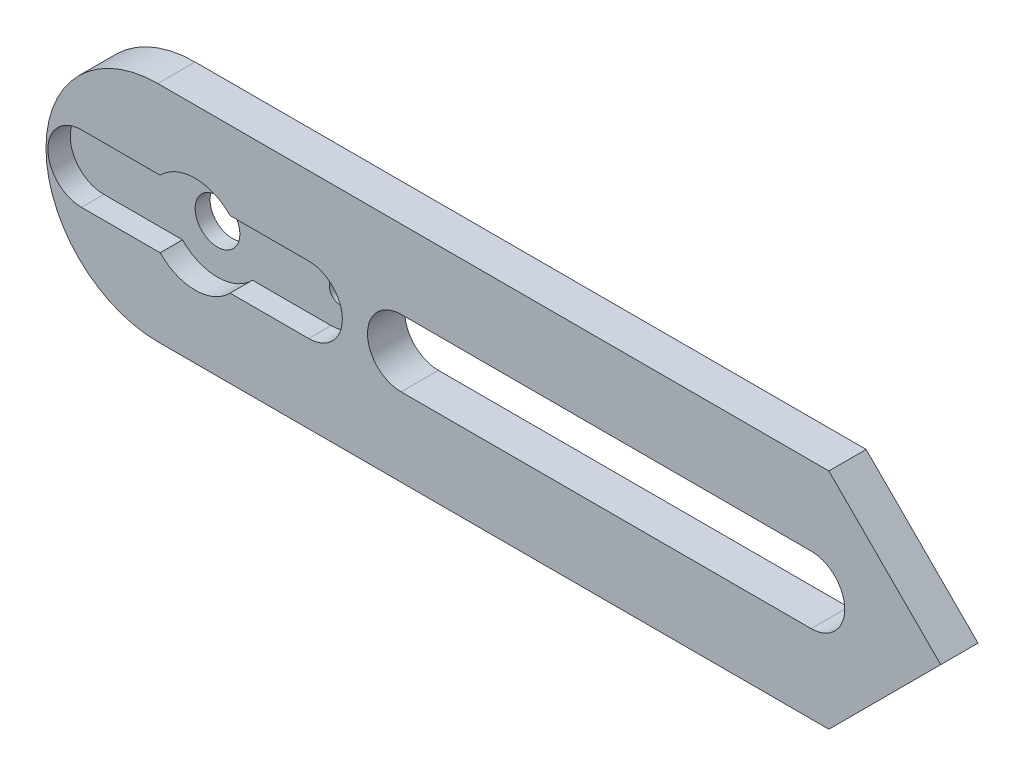
ISO-10303-21;
HEADER;
FILE_DESCRIPTION(('STEP AP214'),'2;1');
FILE_NAME('part.step','',(''),(''),'','','');
FILE_SCHEMA(('AUTOMOTIVE_DESIGN { 1 0 10303 214 1 1 1 1 }'));
ENDSEC;
DATA;
#1=APPLICATION_CONTEXT('core data for automotive mechanical design processes');
#2=APPLICATION_PROTOCOL_DEFINITION('international standard','automotive_design',2000,#1);
#3=PRODUCT_CONTEXT('',#1,'mechanical');
#4=PRODUCT('Part','Part','',(#3));
#5=PRODUCT_RELATED_PRODUCT_CATEGORY('part','',(#4));
#6=PRODUCT_DEFINITION_FORMATION('','',#4);
#7=PRODUCT_DEFINITION_CONTEXT('part definition',#1,'design');
#8=PRODUCT_DEFINITION('design','',#6,#7);
#9=PRODUCT_DEFINITION_SHAPE('','',#8);
#10=(LENGTH_UNIT() NAMED_UNIT(*) SI_UNIT(.MILLI.,.METRE.));
#11=(NAMED_UNIT(*) PLANE_ANGLE_UNIT() SI_UNIT($,.RADIAN.));
#12=(NAMED_UNIT(*) SI_UNIT($,.STERADIAN.) SOLID_ANGLE_UNIT());
#13=UNCERTAINTY_MEASURE_WITH_UNIT(LENGTH_MEASURE(1.E-05),#10,'distance_accuracy_value','');
#14=(GEOMETRIC_REPRESENTATION_CONTEXT(3) GLOBAL_UNCERTAINTY_ASSIGNED_CONTEXT((#13)) GLOBAL_UNIT_ASSIGNED_CONTEXT((#10,
#11,#12)) REPRESENTATION_CONTEXT('',''));
#15=CARTESIAN_POINT('',(0.,0.,0.));
#16=DIRECTION('',(0.,0.,1.));
#17=DIRECTION('',(1.,0.,0.));
#18=AXIS2_PLACEMENT_3D('',#15,#16,#17);
#19=CARTESIAN_POINT('',(-28.5,0.,0.));
#20=DIRECTION('',(0.,0.,1.));
#21=DIRECTION('',(1.,0.,0.));
#22=AXIS2_PLACEMENT_3D('',#19,#20,#21);
#23=CYLINDRICAL_SURFACE('',#22,1.5);
#24=CARTESIAN_POINT('',(-28.5,0.,0.));
#25=DIRECTION('',(0.,0.,1.));
#26=DIRECTION('',(1.,0.,0.));
#27=AXIS2_PLACEMENT_3D('',#24,#25,#26);
#28=CIRCLE('',#27,1.5);
#29=CARTESIAN_POINT('',(-27.,0.,0.));
#30=VERTEX_POINT('',#29);
#31=EDGE_CURVE('E238',#30,#30,#28,.T.);
#32=ORIENTED_EDGE('',*,*,#31,.F.);
#33=EDGE_LOOP('',(#32));
#34=FACE_BOUND('',#33,.T.);
#35=CARTESIAN_POINT('',(-28.5,0.,2.));
#36=DIRECTION('',(0.,0.,1.));
#37=DIRECTION('',(1.,0.,0.));
#38=AXIS2_PLACEMENT_3D('',#35,#36,#37);
#39=CIRCLE('',#38,1.5);
#40=CARTESIAN_POINT('',(-27.,0.,2.));
#41=VERTEX_POINT('',#40);
#42=EDGE_CURVE('E216',#41,#41,#39,.F.);
#43=ORIENTED_EDGE('',*,*,#42,.F.);
#44=EDGE_LOOP('',(#43));
#45=FACE_BOUND('',#44,.T.);
#46=ADVANCED_FACE('F33',(#34,#45),#23,.F.);
#47=CARTESIAN_POINT('',(-45.,0.,2.));
#48=DIRECTION('',(0.,0.,1.));
#49=DIRECTION('',(1.,0.,0.));
#50=AXIS2_PLACEMENT_3D('',#47,#48,#49);
#51=CYLINDRICAL_SURFACE('',#50,6.5);
#52=CARTESIAN_POINT('',(-45.,0.,5.));
#53=DIRECTION('',(0.,0.,1.));
#54=DIRECTION('',(1.,0.,0.));
#55=AXIS2_PLACEMENT_3D('',#52,#53,#54);
#56=CIRCLE('',#55,6.5);
#57=CARTESIAN_POINT('',(-49.6904157598234,-4.49999999999999,5.));
#58=VERTEX_POINT('',#57);
#59=CARTESIAN_POINT('',(-40.3095842401766,-4.49999999999999,5.));
#60=VERTEX_POINT('',#59);
#61=EDGE_CURVE('E225',#58,#60,#56,.T.);
#62=ORIENTED_EDGE('',*,*,#61,.T.);
#63=DIRECTION('',(0.,0.,1.));
#64=VECTOR('',#63,1.);
#65=CARTESIAN_POINT('',(-40.3095842401766,-4.49999999999999,2.));
#66=LINE('',#65,#64);
#67=CARTESIAN_POINT('',(-40.3095842401766,-4.49999999999999,2.));
#68=VERTEX_POINT('',#67);
#69=EDGE_CURVE('E11',#60,#68,#66,.F.);
#70=ORIENTED_EDGE('',*,*,#69,.T.);
#71=CARTESIAN_POINT('',(-45.,0.,2.));
#72=DIRECTION('',(0.,0.,1.));
#73=DIRECTION('',(1.,0.,0.));
#74=AXIS2_PLACEMENT_3D('',#71,#72,#73);
#75=CIRCLE('',#74,6.5);
#76=CARTESIAN_POINT('',(-49.6904157598234,-4.49999999999999,2.));
#77=VERTEX_POINT('',#76);
#78=EDGE_CURVE('E230',#77,#68,#75,.T.);
#79=ORIENTED_EDGE('',*,*,#78,.F.);
#80=DIRECTION('',(0.,0.,1.));
#81=VECTOR('',#80,1.);
#82=CARTESIAN_POINT('',(-49.6904157598234,-4.5,2.));
#83=LINE('',#82,#81);
#84=EDGE_CURVE('E41',#77,#58,#83,.T.);
#85=ORIENTED_EDGE('',*,*,#84,.T.);
#86=EDGE_LOOP('',(#62,#70,#79,#85));
#87=FACE_BOUND('',#86,.T.);
#88=ADVANCED_FACE('F291',(#87),#51,.F.);
#89=CARTESIAN_POINT('',(-45.,0.,0.));
#90=DIRECTION('',(0.,0.,1.));
#91=DIRECTION('',(1.,0.,0.));
#92=AXIS2_PLACEMENT_3D('',#89,#90,#91);
#93=CYLINDRICAL_SURFACE('',#92,3.);
#94=CARTESIAN_POINT('',(-45.,0.,0.));
#95=DIRECTION('',(0.,0.,1.));
#96=DIRECTION('',(1.,0.,0.));
#97=AXIS2_PLACEMENT_3D('',#94,#95,#96);
#98=CIRCLE('',#97,3.);
#99=CARTESIAN_POINT('',(-42.,0.,0.));
#100=VERTEX_POINT('',#99);
#101=EDGE_CURVE('E234',#100,#100,#98,.T.);
#102=ORIENTED_EDGE('',*,*,#101,.F.);
#103=EDGE_LOOP('',(#102));
#104=FACE_BOUND('',#103,.T.);
#105=CARTESIAN_POINT('',(-45.,0.,2.));
#106=DIRECTION('',(0.,0.,1.));
#107=DIRECTION('',(1.,0.,0.));
#108=AXIS2_PLACEMENT_3D('',#105,#106,#107);
#109=CIRCLE('',#108,3.);
#110=CARTESIAN_POINT('',(-42.,0.,2.));
#111=VERTEX_POINT('',#110);
#112=EDGE_CURVE('E229',#111,#111,#109,.F.);
#113=ORIENTED_EDGE('',*,*,#112,.F.);
#114=EDGE_LOOP('',(#113));
#115=FACE_BOUND('',#114,.T.);
#116=ADVANCED_FACE('F345',(#104,#115),#93,.F.);
#117=CARTESIAN_POINT('',(40.,15.,5.));
#118=DIRECTION('',(0.,-1.,0.));
#119=DIRECTION('',(0.,0.,-1.));
#120=AXIS2_PLACEMENT_3D('',#117,#118,#119);
#121=PLANE('',#120);
#122=DIRECTION('',(-1.,0.,0.));
#123=VECTOR('',#122,1.);
#124=CARTESIAN_POINT('',(40.,15.,0.));
#125=LINE('',#124,#123);
#126=CARTESIAN_POINT('',(40.,15.,0.));
#127=VERTEX_POINT('',#126);
#128=CARTESIAN_POINT('',(-50.0000000000001,15.,0.));
#129=VERTEX_POINT('',#128);
#130=EDGE_CURVE('E237',#127,#129,#125,.T.);
#131=ORIENTED_EDGE('',*,*,#130,.T.);
#132=DIRECTION('',(0.,0.,-1.));
#133=VECTOR('',#132,1.);
#134=CARTESIAN_POINT('',(-50.0000000000001,15.,5.));
#135=LINE('',#134,#133);
#136=CARTESIAN_POINT('',(-50.0000000000001,15.,5.));
#137=VERTEX_POINT('',#136);
#138=EDGE_CURVE('E275',#137,#129,#135,.T.);
#139=ORIENTED_EDGE('',*,*,#138,.F.);
#140=DIRECTION('',(-1.,0.,0.));
#141=VECTOR('',#140,1.);
#142=CARTESIAN_POINT('',(40.,15.,5.));
#143=LINE('',#142,#141);
#144=CARTESIAN_POINT('',(40.,15.,5.));
#145=VERTEX_POINT('',#144);
#146=EDGE_CURVE('E241',#145,#137,#143,.T.);
#147=ORIENTED_EDGE('',*,*,#146,.F.);
#148=DIRECTION('',(0.,0.,-1.));
#149=VECTOR('',#148,1.);
#150=CARTESIAN_POINT('',(40.,15.,5.));
#151=LINE('',#150,#149);
#152=EDGE_CURVE('E254',#145,#127,#151,.T.);
#153=ORIENTED_EDGE('',*,*,#152,.T.);
#154=EDGE_LOOP('',(#131,#139,#147,#153));
#155=FACE_BOUND('',#154,.T.);
#156=ADVANCED_FACE('F35',(#155),#121,.F.);
#157=CARTESIAN_POINT('',(-50.,0.,5.));
#158=DIRECTION('',(0.,0.,-1.));
#159=DIRECTION('',(-1.,0.,0.));
#160=AXIS2_PLACEMENT_3D('',#157,#158,#159);
#161=CYLINDRICAL_SURFACE('',#160,15.);
#162=CARTESIAN_POINT('',(-50.,0.,0.));
#163=DIRECTION('',(0.,0.,1.));
#164=DIRECTION('',(1.,0.,0.));
#165=AXIS2_PLACEMENT_3D('',#162,#163,#164);
#166=CIRCLE('',#165,15.);
#167=CARTESIAN_POINT('',(-49.9999999999999,-15.,0.));
#168=VERTEX_POINT('',#167);
#169=EDGE_CURVE('E257',#129,#168,#166,.T.);
#170=ORIENTED_EDGE('',*,*,#169,.T.);
#171=DIRECTION('',(0.,0.,-1.));
#172=VECTOR('',#171,1.);
#173=CARTESIAN_POINT('',(-49.9999999999999,-15.,5.));
#174=LINE('',#173,#172);
#175=CARTESIAN_POINT('',(-49.9999999999999,-15.,5.));
#176=VERTEX_POINT('',#175);
#177=EDGE_CURVE('E273',#176,#168,#174,.T.);
#178=ORIENTED_EDGE('',*,*,#177,.F.);
#179=CARTESIAN_POINT('',(-50.,0.,5.));
#180=DIRECTION('',(0.,0.,1.));
#181=DIRECTION('',(1.,0.,0.));
#182=AXIS2_PLACEMENT_3D('',#179,#180,#181);
#183=CIRCLE('',#182,15.);
#184=EDGE_CURVE('E244',#137,#176,#183,.T.);
#185=ORIENTED_EDGE('',*,*,#184,.F.);
#186=ORIENTED_EDGE('',*,*,#138,.T.);
#187=EDGE_LOOP('',(#170,#178,#185,#186));
#188=FACE_BOUND('',#187,.T.);
#189=ADVANCED_FACE('F365',(#188),#161,.T.);
#190=CARTESIAN_POINT('',(40.,-15.,5.));
#191=DIRECTION('',(0.,-1.,0.));
#192=DIRECTION('',(1.,0.,0.));
#193=AXIS2_PLACEMENT_3D('',#190,#191,#192);
#194=PLANE('',#193);
#195=DIRECTION('',(-1.,0.,0.));
#196=VECTOR('',#195,1.);
#197=CARTESIAN_POINT('',(40.,-15.,0.));
#198=LINE('',#197,#196);
#199=CARTESIAN_POINT('',(40.,-15.,0.));
#200=VERTEX_POINT('',#199);
#201=EDGE_CURVE('E260',#200,#168,#198,.T.);
#202=ORIENTED_EDGE('',*,*,#201,.F.);
#203=DIRECTION('',(0.,0.,-1.));
#204=VECTOR('',#203,1.);
#205=CARTESIAN_POINT('',(40.,-15.,5.));
#206=LINE('',#205,#204);
#207=CARTESIAN_POINT('',(40.,-15.,5.));
#208=VERTEX_POINT('',#207);
#209=EDGE_CURVE('E271',#208,#200,#206,.T.);
#210=ORIENTED_EDGE('',*,*,#209,.F.);
#211=DIRECTION('',(-1.,0.,0.));
#212=VECTOR('',#211,1.);
#213=CARTESIAN_POINT('',(40.,-15.,5.));
#214=LINE('',#213,#212);
#215=EDGE_CURVE('E247',#208,#176,#214,.T.);
#216=ORIENTED_EDGE('',*,*,#215,.T.);
#217=ORIENTED_EDGE('',*,*,#177,.T.);
#218=EDGE_LOOP('',(#202,#210,#216,#217));
#219=FACE_BOUND('',#218,.T.);
#220=ADVANCED_FACE('F362',(#219),#194,.T.);
#221=CARTESIAN_POINT('',(40.,-15.,5.));
#222=DIRECTION('',(-0.707106781186548,0.707106781186547,0.));
#223=DIRECTION('',(-0.707106781186547,-0.707106781186548,0.));
#224=AXIS2_PLACEMENT_3D('',#221,#222,#223);
#225=PLANE('',#224);
#226=DIRECTION('',(0.707106781186547,0.707106781186548,0.));
#227=VECTOR('',#226,1.);
#228=CARTESIAN_POINT('',(40.,-15.,0.));
#229=LINE('',#228,#227);
#230=CARTESIAN_POINT('',(55.,0.,0.));
#231=VERTEX_POINT('',#230);
#232=EDGE_CURVE('E263',#200,#231,#229,.T.);
#233=ORIENTED_EDGE('',*,*,#232,.T.);
#234=DIRECTION('',(0.,0.,-1.));
#235=VECTOR('',#234,1.);
#236=CARTESIAN_POINT('',(55.,0.,5.));
#237=LINE('',#236,#235);
#238=CARTESIAN_POINT('',(55.,0.,5.));
#239=VERTEX_POINT('',#238);
#240=EDGE_CURVE('E268',#239,#231,#237,.T.);
#241=ORIENTED_EDGE('',*,*,#240,.F.);
#242=DIRECTION('',(0.707106781186547,0.707106781186548,0.));
#243=VECTOR('',#242,1.);
#244=CARTESIAN_POINT('',(40.,-15.,5.));
#245=LINE('',#244,#243);
#246=EDGE_CURVE('E250',#208,#239,#245,.T.);
#247=ORIENTED_EDGE('',*,*,#246,.F.);
#248=ORIENTED_EDGE('',*,*,#209,.T.);
#249=EDGE_LOOP('',(#233,#241,#247,#248));
#250=FACE_BOUND('',#249,.T.);
#251=ADVANCED_FACE('F358',(#250),#225,.F.);
#252=CARTESIAN_POINT('',(55.,0.,5.));
#253=DIRECTION('',(-0.707106781186547,-0.707106781186548,0.));
#254=DIRECTION('',(0.707106781186548,-0.707106781186547,0.));
#255=AXIS2_PLACEMENT_3D('',#252,#253,#254);
#256=PLANE('',#255);
#257=DIRECTION('',(-0.707106781186548,0.707106781186547,0.));
#258=VECTOR('',#257,1.);
#259=CARTESIAN_POINT('',(55.,0.,0.));
#260=LINE('',#259,#258);
#261=EDGE_CURVE('E245',#231,#127,#260,.T.);
#262=ORIENTED_EDGE('',*,*,#261,.T.);
#263=ORIENTED_EDGE('',*,*,#152,.F.);
#264=DIRECTION('',(-0.707106781186548,0.707106781186547,0.));
#265=VECTOR('',#264,1.);
#266=CARTESIAN_POINT('',(55.,0.,5.));
#267=LINE('',#266,#265);
#268=EDGE_CURVE('E252',#239,#145,#267,.T.);
#269=ORIENTED_EDGE('',*,*,#268,.F.);
#270=ORIENTED_EDGE('',*,*,#240,.T.);
#271=EDGE_LOOP('',(#262,#263,#269,#270));
#272=FACE_BOUND('',#271,.T.);
#273=ADVANCED_FACE('F352',(#272),#256,.F.);
#274=CARTESIAN_POINT('',(-50.,0.,5.));
#275=DIRECTION('',(0.,0.,1.));
#276=DIRECTION('',(1.,0.,0.));
#277=AXIS2_PLACEMENT_3D('',#274,#275,#276);
#278=PLANE('',#277);
#279=CARTESIAN_POINT('',(-17.3786018999177,0.,5.));
#280=DIRECTION('',(0.,0.,1.));
#281=DIRECTION('',(1.,0.,0.));
#282=AXIS2_PLACEMENT_3D('',#279,#280,#281);
#283=CIRCLE('',#282,4.5);
#284=CARTESIAN_POINT('',(-17.3786018999177,4.5,5.));
#285=VERTEX_POINT('',#284);
#286=CARTESIAN_POINT('',(-17.3786018999177,-4.5,5.));
#287=VERTEX_POINT('',#286);
#288=EDGE_CURVE('E48',#285,#287,#283,.T.);
#289=ORIENTED_EDGE('',*,*,#288,.F.);
#290=DIRECTION('',(-1.,0.,0.));
#291=VECTOR('',#290,1.);
#292=CARTESIAN_POINT('',(-17.3786018999177,4.5,5.));
#293=LINE('',#292,#291);
#294=CARTESIAN_POINT('',(37.6213981000823,4.5,5.));
#295=VERTEX_POINT('',#294);
#296=EDGE_CURVE('E170',#295,#285,#293,.T.);
#297=ORIENTED_EDGE('',*,*,#296,.F.);
#298=CARTESIAN_POINT('',(37.6213981000823,0.,5.));
#299=DIRECTION('',(0.,0.,1.));
#300=DIRECTION('',(1.,0.,0.));
#301=AXIS2_PLACEMENT_3D('',#298,#299,#300);
#302=CIRCLE('',#301,4.5);
#303=CARTESIAN_POINT('',(37.6213981000823,-4.5,5.));
#304=VERTEX_POINT('',#303);
#305=EDGE_CURVE('E173',#304,#295,#302,.T.);
#306=ORIENTED_EDGE('',*,*,#305,.F.);
#307=DIRECTION('',(1.,0.,0.));
#308=VECTOR('',#307,1.);
#309=CARTESIAN_POINT('',(-17.3786018999177,-4.5,5.));
#310=LINE('',#309,#308);
#311=EDGE_CURVE('E179',#287,#304,#310,.T.);
#312=ORIENTED_EDGE('',*,*,#311,.F.);
#313=EDGE_LOOP('',(#289,#297,#306,#312));
#314=FACE_BOUND('',#313,.T.);
#315=DIRECTION('',(1.,0.,0.));
#316=VECTOR('',#315,1.);
#317=CARTESIAN_POINT('',(-29.7555356634191,-4.49999999999999,5.));
#318=LINE('',#317,#316);
#319=CARTESIAN_POINT('',(-29.7555356634191,-4.49999999999999,5.));
#320=VERTEX_POINT('',#319);
#321=EDGE_CURVE('E211',#60,#320,#318,.T.);
#322=ORIENTED_EDGE('',*,*,#321,.F.);
#323=ORIENTED_EDGE('',*,*,#61,.F.);
#324=CARTESIAN_POINT('',(-60.2444643365809,-4.5,5.));
#325=VERTEX_POINT('',#324);
#326=EDGE_CURVE('E193',#325,#58,#318,.T.);
#327=ORIENTED_EDGE('',*,*,#326,.F.);
#328=CARTESIAN_POINT('',(-60.2444643365809,0.,5.));
#329=DIRECTION('',(0.,0.,1.));
#330=DIRECTION('',(1.,0.,0.));
#331=AXIS2_PLACEMENT_3D('',#328,#329,#330);
#332=CIRCLE('',#331,4.5);
#333=CARTESIAN_POINT('',(-60.2444643365809,4.5,5.));
#334=VERTEX_POINT('',#333);
#335=EDGE_CURVE('E208',#334,#325,#332,.T.);
#336=ORIENTED_EDGE('',*,*,#335,.F.);
#337=DIRECTION('',(-1.,0.,0.));
#338=VECTOR('',#337,1.);
#339=CARTESIAN_POINT('',(-29.7555356634191,4.5,5.));
#340=LINE('',#339,#338);
#341=CARTESIAN_POINT('',(-49.6904157598234,4.49999999999999,5.));
#342=VERTEX_POINT('',#341);
#343=EDGE_CURVE('E205',#342,#334,#340,.T.);
#344=ORIENTED_EDGE('',*,*,#343,.F.);
#345=CARTESIAN_POINT('',(-40.3095842401766,4.5,5.));
#346=VERTEX_POINT('',#345);
#347=EDGE_CURVE('E231',#346,#342,#56,.T.);
#348=ORIENTED_EDGE('',*,*,#347,.F.);
#349=CARTESIAN_POINT('',(-29.7555356634191,4.5,5.));
#350=VERTEX_POINT('',#349);
#351=EDGE_CURVE('E206',#350,#346,#340,.T.);
#352=ORIENTED_EDGE('',*,*,#351,.F.);
#353=CARTESIAN_POINT('',(-29.7555356634191,0.,5.));
#354=DIRECTION('',(0.,0.,1.));
#355=DIRECTION('',(1.,0.,0.));
#356=AXIS2_PLACEMENT_3D('',#353,#354,#355);
#357=CIRCLE('',#356,4.5);
#358=EDGE_CURVE('E185',#320,#350,#357,.T.);
#359=ORIENTED_EDGE('',*,*,#358,.F.);
#360=EDGE_LOOP('',(#322,#323,#327,#336,#344,#348,#352,#359));
#361=FACE_BOUND('',#360,.T.);
#362=ORIENTED_EDGE('',*,*,#146,.T.);
#363=ORIENTED_EDGE('',*,*,#184,.T.);
#364=ORIENTED_EDGE('',*,*,#215,.F.);
#365=ORIENTED_EDGE('',*,*,#246,.T.);
#366=ORIENTED_EDGE('',*,*,#268,.T.);
#367=EDGE_LOOP('',(#362,#363,#364,#365,#366));
#368=FACE_BOUND('',#367,.T.);
#369=ADVANCED_FACE('F298',(#314,#361,#368),#278,.T.);
#370=CARTESIAN_POINT('',(-50.,0.,0.));
#371=DIRECTION('',(0.,0.,1.));
#372=DIRECTION('',(1.,0.,0.));
#373=AXIS2_PLACEMENT_3D('',#370,#371,#372);
#374=PLANE('',#373);
#375=DIRECTION('',(-1.,0.,0.));
#376=VECTOR('',#375,1.);
#377=CARTESIAN_POINT('',(-17.3786018999177,4.5,0.));
#378=LINE('',#377,#376);
#379=CARTESIAN_POINT('',(37.6213981000823,4.5,0.));
#380=VERTEX_POINT('',#379);
#381=CARTESIAN_POINT('',(-17.3786018999177,4.5,0.));
#382=VERTEX_POINT('',#381);
#383=EDGE_CURVE('E160',#380,#382,#378,.T.);
#384=ORIENTED_EDGE('',*,*,#383,.T.);
#385=CARTESIAN_POINT('',(-17.3786018999177,0.,0.));
#386=DIRECTION('',(0.,0.,1.));
#387=DIRECTION('',(1.,0.,0.));
#388=AXIS2_PLACEMENT_3D('',#385,#386,#387);
#389=CIRCLE('',#388,4.5);
#390=CARTESIAN_POINT('',(-17.3786018999177,-4.5,0.));
#391=VERTEX_POINT('',#390);
#392=EDGE_CURVE('E154',#382,#391,#389,.T.);
#393=ORIENTED_EDGE('',*,*,#392,.T.);
#394=DIRECTION('',(1.,0.,0.));
#395=VECTOR('',#394,1.);
#396=CARTESIAN_POINT('',(-17.3786018999177,-4.5,0.));
#397=LINE('',#396,#395);
#398=CARTESIAN_POINT('',(37.6213981000823,-4.5,0.));
#399=VERTEX_POINT('',#398);
#400=EDGE_CURVE('E163',#391,#399,#397,.T.);
#401=ORIENTED_EDGE('',*,*,#400,.T.);
#402=CARTESIAN_POINT('',(37.6213981000823,0.,0.));
#403=DIRECTION('',(0.,0.,1.));
#404=DIRECTION('',(1.,0.,0.));
#405=AXIS2_PLACEMENT_3D('',#402,#403,#404);
#406=CIRCLE('',#405,4.5);
#407=EDGE_CURVE('E56',#399,#380,#406,.T.);
#408=ORIENTED_EDGE('',*,*,#407,.T.);
#409=EDGE_LOOP('',(#384,#393,#401,#408));
#410=FACE_BOUND('',#409,.T.);
#411=ORIENTED_EDGE('',*,*,#101,.T.);
#412=EDGE_LOOP('',(#411));
#413=FACE_BOUND('',#412,.T.);
#414=ORIENTED_EDGE('',*,*,#31,.T.);
#415=EDGE_LOOP('',(#414));
#416=FACE_BOUND('',#415,.T.);
#417=ORIENTED_EDGE('',*,*,#130,.F.);
#418=ORIENTED_EDGE('',*,*,#261,.F.);
#419=ORIENTED_EDGE('',*,*,#232,.F.);
#420=ORIENTED_EDGE('',*,*,#201,.T.);
#421=ORIENTED_EDGE('',*,*,#169,.F.);
#422=EDGE_LOOP('',(#417,#418,#419,#420,#421));
#423=FACE_BOUND('',#422,.T.);
#424=ADVANCED_FACE('F167',(#410,#413,#416,#423),#374,.F.);
#425=CARTESIAN_POINT('',(-45.,0.,2.));
#426=DIRECTION('',(0.,0.,1.));
#427=DIRECTION('',(1.,0.,0.));
#428=AXIS2_PLACEMENT_3D('',#425,#426,#427);
#429=PLANE('',#428);
#430=CARTESIAN_POINT('',(-40.3095842401766,4.5,2.));
#431=VERTEX_POINT('',#430);
#432=CARTESIAN_POINT('',(-49.6904157598234,4.49999999999999,2.));
#433=VERTEX_POINT('',#432);
#434=EDGE_CURVE('E226',#431,#433,#75,.T.);
#435=ORIENTED_EDGE('',*,*,#434,.T.);
#436=DIRECTION('',(-1.,0.,0.));
#437=VECTOR('',#436,1.);
#438=CARTESIAN_POINT('',(-29.7555356634191,4.5,2.));
#439=LINE('',#438,#437);
#440=CARTESIAN_POINT('',(-60.2444643365809,4.5,2.));
#441=VERTEX_POINT('',#440);
#442=EDGE_CURVE('E192',#433,#441,#439,.T.);
#443=ORIENTED_EDGE('',*,*,#442,.T.);
#444=CARTESIAN_POINT('',(-60.2444643365809,0.,2.));
#445=DIRECTION('',(0.,0.,1.));
#446=DIRECTION('',(1.,0.,0.));
#447=AXIS2_PLACEMENT_3D('',#444,#445,#446);
#448=CIRCLE('',#447,4.5);
#449=CARTESIAN_POINT('',(-60.2444643365809,-4.5,2.));
#450=VERTEX_POINT('',#449);
#451=EDGE_CURVE('E196',#441,#450,#448,.T.);
#452=ORIENTED_EDGE('',*,*,#451,.T.);
#453=DIRECTION('',(1.,0.,0.));
#454=VECTOR('',#453,1.);
#455=CARTESIAN_POINT('',(-29.7555356634191,-4.49999999999999,2.));
#456=LINE('',#455,#454);
#457=EDGE_CURVE('E200',#450,#77,#456,.T.);
#458=ORIENTED_EDGE('',*,*,#457,.T.);
#459=ORIENTED_EDGE('',*,*,#78,.T.);
#460=CARTESIAN_POINT('',(-29.7555356634191,-4.49999999999999,2.));
#461=VERTEX_POINT('',#460);
#462=EDGE_CURVE('E199',#68,#461,#456,.T.);
#463=ORIENTED_EDGE('',*,*,#462,.T.);
#464=CARTESIAN_POINT('',(-29.7555356634191,0.,2.));
#465=DIRECTION('',(0.,0.,1.));
#466=DIRECTION('',(1.,0.,0.));
#467=AXIS2_PLACEMENT_3D('',#464,#465,#466);
#468=CIRCLE('',#467,4.5);
#469=CARTESIAN_POINT('',(-29.7555356634191,4.5,2.));
#470=VERTEX_POINT('',#469);
#471=EDGE_CURVE('E189',#461,#470,#468,.T.);
#472=ORIENTED_EDGE('',*,*,#471,.T.);
#473=EDGE_CURVE('E194',#470,#431,#439,.T.);
#474=ORIENTED_EDGE('',*,*,#473,.T.);
#475=EDGE_LOOP('',(#435,#443,#452,#458,#459,#463,#472,#474));
#476=FACE_BOUND('',#475,.T.);
#477=ORIENTED_EDGE('',*,*,#112,.T.);
#478=EDGE_LOOP('',(#477));
#479=FACE_BOUND('',#478,.T.);
#480=ORIENTED_EDGE('',*,*,#42,.T.);
#481=EDGE_LOOP('',(#480));
#482=FACE_BOUND('',#481,.T.);
#483=ADVANCED_FACE('F311',(#476,#479,#482),#429,.T.);
#484=ORIENTED_EDGE('',*,*,#347,.T.);
#485=DIRECTION('',(0.,0.,1.));
#486=VECTOR('',#485,1.);
#487=CARTESIAN_POINT('',(-49.6904157598234,4.5,2.));
#488=LINE('',#487,#486);
#489=EDGE_CURVE('E283',#342,#433,#488,.F.);
#490=ORIENTED_EDGE('',*,*,#489,.T.);
#491=ORIENTED_EDGE('',*,*,#434,.F.);
#492=DIRECTION('',(0.,0.,1.));
#493=VECTOR('',#492,1.);
#494=CARTESIAN_POINT('',(-40.3095842401766,4.5,2.));
#495=LINE('',#494,#493);
#496=EDGE_CURVE('E278',#431,#346,#495,.T.);
#497=ORIENTED_EDGE('',*,*,#496,.T.);
#498=EDGE_LOOP('',(#484,#490,#491,#497));
#499=FACE_BOUND('',#498,.T.);
#500=ADVANCED_FACE('F323',(#499),#51,.F.);
#501=CARTESIAN_POINT('',(-29.7555356634191,4.5,2.));
#502=DIRECTION('',(0.,1.,0.));
#503=DIRECTION('',(-1.,0.,0.));
#504=AXIS2_PLACEMENT_3D('',#501,#502,#503);
#505=PLANE('',#504);
#506=ORIENTED_EDGE('',*,*,#473,.F.);
#507=DIRECTION('',(0.,0.,1.));
#508=VECTOR('',#507,1.);
#509=CARTESIAN_POINT('',(-29.7555356634191,4.5,2.));
#510=LINE('',#509,#508);
#511=EDGE_CURVE('E202',#470,#350,#510,.T.);
#512=ORIENTED_EDGE('',*,*,#511,.T.);
#513=ORIENTED_EDGE('',*,*,#351,.T.);
#514=ORIENTED_EDGE('',*,*,#496,.F.);
#515=EDGE_LOOP('',(#506,#512,#513,#514));
#516=FACE_BOUND('',#515,.T.);
#517=ADVANCED_FACE('F326',(#516),#505,.F.);
#518=CARTESIAN_POINT('',(-29.7555356634191,-4.49999999999999,2.));
#519=DIRECTION('',(0.,-1.,0.));
#520=DIRECTION('',(1.,0.,0.));
#521=AXIS2_PLACEMENT_3D('',#518,#519,#520);
#522=PLANE('',#521);
#523=ORIENTED_EDGE('',*,*,#321,.T.);
#524=DIRECTION('',(0.,0.,1.));
#525=VECTOR('',#524,1.);
#526=CARTESIAN_POINT('',(-29.7555356634191,-4.49999999999999,2.));
#527=LINE('',#526,#525);
#528=EDGE_CURVE('E213',#461,#320,#527,.T.);
#529=ORIENTED_EDGE('',*,*,#528,.F.);
#530=ORIENTED_EDGE('',*,*,#462,.F.);
#531=ORIENTED_EDGE('',*,*,#69,.F.);
#532=EDGE_LOOP('',(#523,#529,#530,#531));
#533=FACE_BOUND('',#532,.T.);
#534=ADVANCED_FACE('F305',(#533),#522,.F.);
#535=CARTESIAN_POINT('',(-29.7555356634191,0.,2.));
#536=DIRECTION('',(0.,0.,1.));
#537=DIRECTION('',(1.,0.,0.));
#538=AXIS2_PLACEMENT_3D('',#535,#536,#537);
#539=CYLINDRICAL_SURFACE('',#538,4.5);
#540=ORIENTED_EDGE('',*,*,#358,.T.);
#541=ORIENTED_EDGE('',*,*,#511,.F.);
#542=ORIENTED_EDGE('',*,*,#471,.F.);
#543=ORIENTED_EDGE('',*,*,#528,.T.);
#544=EDGE_LOOP('',(#540,#541,#542,#543));
#545=FACE_BOUND('',#544,.T.);
#546=ADVANCED_FACE('F308',(#545),#539,.F.);
#547=ORIENTED_EDGE('',*,*,#457,.F.);
#548=DIRECTION('',(0.,0.,1.));
#549=VECTOR('',#548,1.);
#550=CARTESIAN_POINT('',(-60.2444643365809,-4.5,2.));
#551=LINE('',#550,#549);
#552=EDGE_CURVE('E217',#450,#325,#551,.T.);
#553=ORIENTED_EDGE('',*,*,#552,.T.);
#554=ORIENTED_EDGE('',*,*,#326,.T.);
#555=ORIENTED_EDGE('',*,*,#84,.F.);
#556=EDGE_LOOP('',(#547,#553,#554,#555));
#557=FACE_BOUND('',#556,.T.);
#558=ADVANCED_FACE('F315',(#557),#522,.F.);
#559=ORIENTED_EDGE('',*,*,#343,.T.);
#560=DIRECTION('',(0.,0.,1.));
#561=VECTOR('',#560,1.);
#562=CARTESIAN_POINT('',(-60.2444643365809,4.5,2.));
#563=LINE('',#562,#561);
#564=EDGE_CURVE('E219',#441,#334,#563,.T.);
#565=ORIENTED_EDGE('',*,*,#564,.F.);
#566=ORIENTED_EDGE('',*,*,#442,.F.);
#567=ORIENTED_EDGE('',*,*,#489,.F.);
#568=EDGE_LOOP('',(#559,#565,#566,#567));
#569=FACE_BOUND('',#568,.T.);
#570=ADVANCED_FACE('F329',(#569),#505,.F.);
#571=CARTESIAN_POINT('',(-60.2444643365809,0.,2.));
#572=DIRECTION('',(0.,0.,1.));
#573=DIRECTION('',(1.,0.,0.));
#574=AXIS2_PLACEMENT_3D('',#571,#572,#573);
#575=CYLINDRICAL_SURFACE('',#574,4.5);
#576=ORIENTED_EDGE('',*,*,#335,.T.);
#577=ORIENTED_EDGE('',*,*,#552,.F.);
#578=ORIENTED_EDGE('',*,*,#451,.F.);
#579=ORIENTED_EDGE('',*,*,#564,.T.);
#580=EDGE_LOOP('',(#576,#577,#578,#579));
#581=FACE_BOUND('',#580,.T.);
#582=ADVANCED_FACE('F317',(#581),#575,.F.);
#583=CARTESIAN_POINT('',(-17.3786018999177,0.,0.));
#584=DIRECTION('',(0.,0.,1.));
#585=DIRECTION('',(1.,0.,0.));
#586=AXIS2_PLACEMENT_3D('',#583,#584,#585);
#587=CYLINDRICAL_SURFACE('',#586,4.5);
#588=ORIENTED_EDGE('',*,*,#288,.T.);
#589=DIRECTION('',(0.,0.,1.));
#590=VECTOR('',#589,1.);
#591=CARTESIAN_POINT('',(-17.3786018999177,-4.5,0.));
#592=LINE('',#591,#590);
#593=EDGE_CURVE('E150',#391,#287,#592,.T.);
#594=ORIENTED_EDGE('',*,*,#593,.F.);
#595=ORIENTED_EDGE('',*,*,#392,.F.);
#596=DIRECTION('',(0.,0.,1.));
#597=VECTOR('',#596,1.);
#598=CARTESIAN_POINT('',(-17.3786018999177,4.5,0.));
#599=LINE('',#598,#597);
#600=EDGE_CURVE('E183',#382,#285,#599,.T.);
#601=ORIENTED_EDGE('',*,*,#600,.T.);
#602=EDGE_LOOP('',(#588,#594,#595,#601));
#603=FACE_BOUND('',#602,.T.);
#604=ADVANCED_FACE('F152',(#603),#587,.F.);
#605=CARTESIAN_POINT('',(-17.3786018999177,4.5,0.));
#606=DIRECTION('',(0.,1.,0.));
#607=DIRECTION('',(0.,0.,1.));
#608=AXIS2_PLACEMENT_3D('',#605,#606,#607);
#609=PLANE('',#608);
#610=ORIENTED_EDGE('',*,*,#296,.T.);
#611=ORIENTED_EDGE('',*,*,#600,.F.);
#612=ORIENTED_EDGE('',*,*,#383,.F.);
#613=DIRECTION('',(0.,0.,1.));
#614=VECTOR('',#613,1.);
#615=CARTESIAN_POINT('',(37.6213981000823,4.5,0.));
#616=LINE('',#615,#614);
#617=EDGE_CURVE('E186',#380,#295,#616,.T.);
#618=ORIENTED_EDGE('',*,*,#617,.T.);
#619=EDGE_LOOP('',(#610,#611,#612,#618));
#620=FACE_BOUND('',#619,.T.);
#621=ADVANCED_FACE('F413',(#620),#609,.F.);
#622=CARTESIAN_POINT('',(37.6213981000823,0.,0.));
#623=DIRECTION('',(0.,0.,1.));
#624=DIRECTION('',(1.,0.,0.));
#625=AXIS2_PLACEMENT_3D('',#622,#623,#624);
#626=CYLINDRICAL_SURFACE('',#625,4.5);
#627=ORIENTED_EDGE('',*,*,#305,.T.);
#628=ORIENTED_EDGE('',*,*,#617,.F.);
#629=ORIENTED_EDGE('',*,*,#407,.F.);
#630=DIRECTION('',(0.,0.,1.));
#631=VECTOR('',#630,1.);
#632=CARTESIAN_POINT('',(37.6213981000823,-4.5,0.));
#633=LINE('',#632,#631);
#634=EDGE_CURVE('E159',#399,#304,#633,.T.);
#635=ORIENTED_EDGE('',*,*,#634,.T.);
#636=EDGE_LOOP('',(#627,#628,#629,#635));
#637=FACE_BOUND('',#636,.T.);
#638=ADVANCED_FACE('F417',(#637),#626,.F.);
#639=CARTESIAN_POINT('',(-17.3786018999177,-4.5,0.));
#640=DIRECTION('',(0.,-1.,0.));
#641=DIRECTION('',(0.,0.,-1.));
#642=AXIS2_PLACEMENT_3D('',#639,#640,#641);
#643=PLANE('',#642);
#644=ORIENTED_EDGE('',*,*,#311,.T.);
#645=ORIENTED_EDGE('',*,*,#634,.F.);
#646=ORIENTED_EDGE('',*,*,#400,.F.);
#647=ORIENTED_EDGE('',*,*,#593,.T.);
#648=EDGE_LOOP('',(#644,#645,#646,#647));
#649=FACE_BOUND('',#648,.T.);
#650=ADVANCED_FACE('F164',(#649),#643,.F.);
#651=CLOSED_SHELL('',(#46,#88,#116,#156,#189,#220,#251,#273,#369,#424,#483,#500,#517,#534,#546,
#558,#570,#582,#604,#621,#638,#650));
#652=MANIFOLD_SOLID_BREP('B2',#651);
#653=ADVANCED_BREP_SHAPE_REPRESENTATION('',(#18,#652),#14);
#654=SHAPE_DEFINITION_REPRESENTATION(#9,#653);
ENDSEC;
END-ISO-10303-21;
